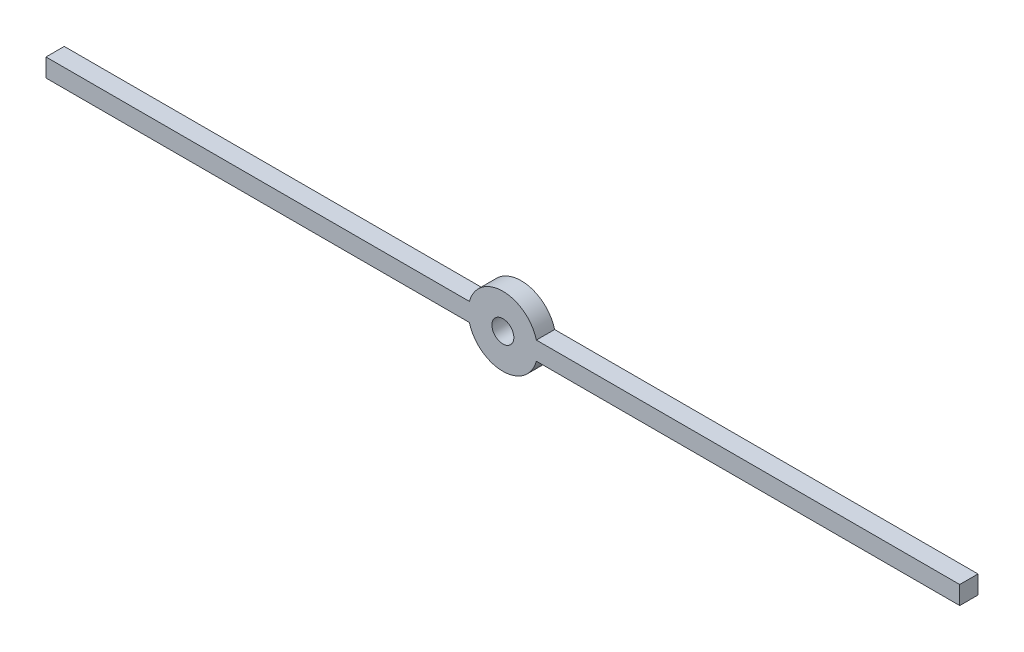
ISO-10303-21;
HEADER;
FILE_DESCRIPTION(('STEP AP214'),'2;1');
FILE_NAME('part.step','',(''),(''),'','','');
FILE_SCHEMA(('AUTOMOTIVE_DESIGN { 1 0 10303 214 1 1 1 1 }'));
ENDSEC;
DATA;
#1=APPLICATION_CONTEXT('core data for automotive mechanical design processes');
#2=APPLICATION_PROTOCOL_DEFINITION('international standard','automotive_design',2000,#1);
#3=PRODUCT_CONTEXT('',#1,'mechanical');
#4=PRODUCT('Part','Part','',(#3));
#5=PRODUCT_RELATED_PRODUCT_CATEGORY('part','',(#4));
#6=PRODUCT_DEFINITION_FORMATION('','',#4);
#7=PRODUCT_DEFINITION_CONTEXT('part definition',#1,'design');
#8=PRODUCT_DEFINITION('design','',#6,#7);
#9=PRODUCT_DEFINITION_SHAPE('','',#8);
#10=(LENGTH_UNIT() NAMED_UNIT(*) SI_UNIT(.MILLI.,.METRE.));
#11=(NAMED_UNIT(*) PLANE_ANGLE_UNIT() SI_UNIT($,.RADIAN.));
#12=(NAMED_UNIT(*) SI_UNIT($,.STERADIAN.) SOLID_ANGLE_UNIT());
#13=UNCERTAINTY_MEASURE_WITH_UNIT(LENGTH_MEASURE(1.E-05),#10,'distance_accuracy_value','');
#14=(GEOMETRIC_REPRESENTATION_CONTEXT(3) GLOBAL_UNCERTAINTY_ASSIGNED_CONTEXT((#13)) GLOBAL_UNIT_ASSIGNED_CONTEXT((#10,
#11,#12)) REPRESENTATION_CONTEXT('',''));
#15=CARTESIAN_POINT('',(0.,0.,0.));
#16=DIRECTION('',(0.,0.,1.));
#17=DIRECTION('',(1.,0.,0.));
#18=AXIS2_PLACEMENT_3D('',#15,#16,#17);
#19=CARTESIAN_POINT('',(-1.94289029309402E-13,0.,5.));
#20=DIRECTION('',(0.,0.,1.));
#21=DIRECTION('',(1.,0.,0.));
#22=AXIS2_PLACEMENT_3D('',#19,#20,#21);
#23=PLANE('',#22);
#24=DIRECTION('',(-1.,0.,0.));
#25=VECTOR('',#24,1.);
#26=CARTESIAN_POINT('',(9.16515138991148,2.5,5.));
#27=LINE('',#26,#25);
#28=CARTESIAN_POINT('',(125.,2.5,5.));
#29=VERTEX_POINT('',#28);
#30=CARTESIAN_POINT('',(9.16515138991149,2.5,5.));
#31=VERTEX_POINT('',#30);
#32=EDGE_CURVE('E164',#29,#31,#27,.T.);
#33=ORIENTED_EDGE('',*,*,#32,.T.);
#34=CARTESIAN_POINT('',(-1.94289029309402E-13,0.,5.));
#35=DIRECTION('',(0.,0.,1.));
#36=DIRECTION('',(1.,0.,0.));
#37=AXIS2_PLACEMENT_3D('',#34,#35,#36);
#38=CIRCLE('',#37,9.5);
#39=CARTESIAN_POINT('',(-9.16515138991188,2.5,5.));
#40=VERTEX_POINT('',#39);
#41=EDGE_CURVE('E100',#31,#40,#38,.T.);
#42=ORIENTED_EDGE('',*,*,#41,.T.);
#43=DIRECTION('',(-1.,0.,0.));
#44=VECTOR('',#43,1.);
#45=CARTESIAN_POINT('',(-125.,2.5,5.));
#46=LINE('',#45,#44);
#47=CARTESIAN_POINT('',(-125.,2.5,5.));
#48=VERTEX_POINT('',#47);
#49=EDGE_CURVE('E185',#40,#48,#46,.T.);
#50=ORIENTED_EDGE('',*,*,#49,.T.);
#51=DIRECTION('',(0.,-1.,0.));
#52=VECTOR('',#51,1.);
#53=CARTESIAN_POINT('',(-125.,-2.5,5.));
#54=LINE('',#53,#52);
#55=CARTESIAN_POINT('',(-125.,-2.5,5.));
#56=VERTEX_POINT('',#55);
#57=EDGE_CURVE('E199',#48,#56,#54,.T.);
#58=ORIENTED_EDGE('',*,*,#57,.T.);
#59=DIRECTION('',(1.,0.,0.));
#60=VECTOR('',#59,1.);
#61=CARTESIAN_POINT('',(-125.,-2.5,5.));
#62=LINE('',#61,#60);
#63=CARTESIAN_POINT('',(-9.16515138991188,-2.5,5.));
#64=VERTEX_POINT('',#63);
#65=EDGE_CURVE('E119',#56,#64,#62,.T.);
#66=ORIENTED_EDGE('',*,*,#65,.T.);
#67=CARTESIAN_POINT('',(-1.94289029309402E-13,0.,5.));
#68=DIRECTION('',(0.,0.,1.));
#69=DIRECTION('',(1.,0.,0.));
#70=AXIS2_PLACEMENT_3D('',#67,#68,#69);
#71=CIRCLE('',#70,9.5);
#72=CARTESIAN_POINT('',(9.16515138991149,-2.5,5.));
#73=VERTEX_POINT('',#72);
#74=EDGE_CURVE('E113',#64,#73,#71,.T.);
#75=ORIENTED_EDGE('',*,*,#74,.T.);
#76=DIRECTION('',(1.,0.,0.));
#77=VECTOR('',#76,1.);
#78=CARTESIAN_POINT('',(9.16515138991149,-2.5,5.));
#79=LINE('',#78,#77);
#80=CARTESIAN_POINT('',(125.,-2.5,5.));
#81=VERTEX_POINT('',#80);
#82=EDGE_CURVE('E117',#73,#81,#79,.T.);
#83=ORIENTED_EDGE('',*,*,#82,.T.);
#84=DIRECTION('',(0.,1.,0.));
#85=VECTOR('',#84,1.);
#86=CARTESIAN_POINT('',(125.,-2.5,5.));
#87=LINE('',#86,#85);
#88=EDGE_CURVE('E57',#81,#29,#87,.T.);
#89=ORIENTED_EDGE('',*,*,#88,.T.);
#90=EDGE_LOOP('',(#33,#42,#50,#58,#66,#75,#83,#89));
#91=FACE_BOUND('',#90,.T.);
#92=CARTESIAN_POINT('',(-1.94289029309402E-13,0.,5.));
#93=DIRECTION('',(0.,0.,1.));
#94=DIRECTION('',(1.,0.,0.));
#95=AXIS2_PLACEMENT_3D('',#92,#93,#94);
#96=CIRCLE('',#95,3.);
#97=CARTESIAN_POINT('',(2.99999999999981,0.,5.));
#98=VERTEX_POINT('',#97);
#99=EDGE_CURVE('E146',#98,#98,#96,.T.);
#100=ORIENTED_EDGE('',*,*,#99,.F.);
#101=EDGE_LOOP('',(#100));
#102=FACE_BOUND('',#101,.T.);
#103=ADVANCED_FACE('F39',(#91,#102),#23,.T.);
#104=CARTESIAN_POINT('',(-1.94289029309402E-13,0.,0.));
#105=DIRECTION('',(0.,0.,1.));
#106=DIRECTION('',(1.,0.,0.));
#107=AXIS2_PLACEMENT_3D('',#104,#105,#106);
#108=PLANE('',#107);
#109=DIRECTION('',(-1.,0.,0.));
#110=VECTOR('',#109,1.);
#111=CARTESIAN_POINT('',(9.16515138991148,2.5,0.));
#112=LINE('',#111,#110);
#113=CARTESIAN_POINT('',(125.,2.5,0.));
#114=VERTEX_POINT('',#113);
#115=CARTESIAN_POINT('',(9.16515138991149,2.5,0.));
#116=VERTEX_POINT('',#115);
#117=EDGE_CURVE('E141',#114,#116,#112,.T.);
#118=ORIENTED_EDGE('',*,*,#117,.F.);
#119=DIRECTION('',(0.,1.,0.));
#120=VECTOR('',#119,1.);
#121=CARTESIAN_POINT('',(125.,-2.5,0.));
#122=LINE('',#121,#120);
#123=CARTESIAN_POINT('',(125.,-2.5,0.));
#124=VERTEX_POINT('',#123);
#125=EDGE_CURVE('E92',#124,#114,#122,.T.);
#126=ORIENTED_EDGE('',*,*,#125,.F.);
#127=DIRECTION('',(1.,0.,0.));
#128=VECTOR('',#127,1.);
#129=CARTESIAN_POINT('',(9.16515138991149,-2.5,0.));
#130=LINE('',#129,#128);
#131=CARTESIAN_POINT('',(9.16515138991149,-2.5,0.));
#132=VERTEX_POINT('',#131);
#133=EDGE_CURVE('E86',#132,#124,#130,.T.);
#134=ORIENTED_EDGE('',*,*,#133,.F.);
#135=CARTESIAN_POINT('',(-1.94289029309402E-13,0.,0.));
#136=DIRECTION('',(0.,0.,1.));
#137=DIRECTION('',(1.,0.,0.));
#138=AXIS2_PLACEMENT_3D('',#135,#136,#137);
#139=CIRCLE('',#138,9.5);
#140=CARTESIAN_POINT('',(-9.16515138991188,-2.5,0.));
#141=VERTEX_POINT('',#140);
#142=EDGE_CURVE('E128',#141,#132,#139,.T.);
#143=ORIENTED_EDGE('',*,*,#142,.F.);
#144=DIRECTION('',(1.,0.,0.));
#145=VECTOR('',#144,1.);
#146=CARTESIAN_POINT('',(-125.,-2.5,0.));
#147=LINE('',#146,#145);
#148=CARTESIAN_POINT('',(-125.,-2.5,0.));
#149=VERTEX_POINT('',#148);
#150=EDGE_CURVE('E155',#149,#141,#147,.T.);
#151=ORIENTED_EDGE('',*,*,#150,.F.);
#152=DIRECTION('',(0.,-1.,0.));
#153=VECTOR('',#152,1.);
#154=CARTESIAN_POINT('',(-125.,-2.5,0.));
#155=LINE('',#154,#153);
#156=CARTESIAN_POINT('',(-125.,2.5,0.));
#157=VERTEX_POINT('',#156);
#158=EDGE_CURVE('E152',#157,#149,#155,.T.);
#159=ORIENTED_EDGE('',*,*,#158,.F.);
#160=DIRECTION('',(-1.,0.,0.));
#161=VECTOR('',#160,1.);
#162=CARTESIAN_POINT('',(-125.,2.5,0.));
#163=LINE('',#162,#161);
#164=CARTESIAN_POINT('',(-9.16515138991188,2.5,0.));
#165=VERTEX_POINT('',#164);
#166=EDGE_CURVE('E149',#165,#157,#163,.T.);
#167=ORIENTED_EDGE('',*,*,#166,.F.);
#168=CARTESIAN_POINT('',(-1.94289029309402E-13,0.,0.));
#169=DIRECTION('',(0.,0.,1.));
#170=DIRECTION('',(1.,0.,0.));
#171=AXIS2_PLACEMENT_3D('',#168,#169,#170);
#172=CIRCLE('',#171,9.5);
#173=EDGE_CURVE('E145',#116,#165,#172,.T.);
#174=ORIENTED_EDGE('',*,*,#173,.F.);
#175=EDGE_LOOP('',(#118,#126,#134,#143,#151,#159,#167,#174));
#176=FACE_BOUND('',#175,.T.);
#177=CARTESIAN_POINT('',(-1.94289029309402E-13,0.,0.));
#178=DIRECTION('',(0.,0.,1.));
#179=DIRECTION('',(1.,0.,0.));
#180=AXIS2_PLACEMENT_3D('',#177,#178,#179);
#181=CIRCLE('',#180,3.);
#182=CARTESIAN_POINT('',(2.99999999999981,0.,0.));
#183=VERTEX_POINT('',#182);
#184=EDGE_CURVE('E209',#183,#183,#181,.T.);
#185=ORIENTED_EDGE('',*,*,#184,.T.);
#186=EDGE_LOOP('',(#185));
#187=FACE_BOUND('',#186,.T.);
#188=ADVANCED_FACE('F189',(#176,#187),#108,.F.);
#189=CARTESIAN_POINT('',(9.16515138991148,2.5,5.));
#190=DIRECTION('',(0.,-1.,0.));
#191=DIRECTION('',(0.,0.,-1.));
#192=AXIS2_PLACEMENT_3D('',#189,#190,#191);
#193=PLANE('',#192);
#194=ORIENTED_EDGE('',*,*,#117,.T.);
#195=DIRECTION('',(0.,0.,-1.));
#196=VECTOR('',#195,1.);
#197=CARTESIAN_POINT('',(9.16515138991149,2.5,5.));
#198=LINE('',#197,#196);
#199=EDGE_CURVE('E11',#31,#116,#198,.T.);
#200=ORIENTED_EDGE('',*,*,#199,.F.);
#201=ORIENTED_EDGE('',*,*,#32,.F.);
#202=DIRECTION('',(0.,0.,-1.));
#203=VECTOR('',#202,1.);
#204=CARTESIAN_POINT('',(125.,2.5,5.));
#205=LINE('',#204,#203);
#206=EDGE_CURVE('E137',#29,#114,#205,.T.);
#207=ORIENTED_EDGE('',*,*,#206,.T.);
#208=EDGE_LOOP('',(#194,#200,#201,#207));
#209=FACE_BOUND('',#208,.T.);
#210=ADVANCED_FACE('F41',(#209),#193,.F.);
#211=CARTESIAN_POINT('',(-1.94289029309402E-13,0.,5.));
#212=DIRECTION('',(0.,0.,-1.));
#213=DIRECTION('',(-1.,0.,0.));
#214=AXIS2_PLACEMENT_3D('',#211,#212,#213);
#215=CYLINDRICAL_SURFACE('',#214,9.5);
#216=ORIENTED_EDGE('',*,*,#173,.T.);
#217=DIRECTION('',(0.,0.,-1.));
#218=VECTOR('',#217,1.);
#219=CARTESIAN_POINT('',(-9.16515138991188,2.5,5.));
#220=LINE('',#219,#218);
#221=EDGE_CURVE('E49',#40,#165,#220,.T.);
#222=ORIENTED_EDGE('',*,*,#221,.F.);
#223=ORIENTED_EDGE('',*,*,#41,.F.);
#224=ORIENTED_EDGE('',*,*,#199,.T.);
#225=EDGE_LOOP('',(#216,#222,#223,#224));
#226=FACE_BOUND('',#225,.T.);
#227=ADVANCED_FACE('F239',(#226),#215,.T.);
#228=CARTESIAN_POINT('',(-125.,2.5,5.));
#229=DIRECTION('',(0.,-1.,0.));
#230=DIRECTION('',(0.,0.,-1.));
#231=AXIS2_PLACEMENT_3D('',#228,#229,#230);
#232=PLANE('',#231);
#233=ORIENTED_EDGE('',*,*,#166,.T.);
#234=DIRECTION('',(0.,0.,-1.));
#235=VECTOR('',#234,1.);
#236=CARTESIAN_POINT('',(-125.,2.5,5.));
#237=LINE('',#236,#235);
#238=EDGE_CURVE('E175',#48,#157,#237,.T.);
#239=ORIENTED_EDGE('',*,*,#238,.F.);
#240=ORIENTED_EDGE('',*,*,#49,.F.);
#241=ORIENTED_EDGE('',*,*,#221,.T.);
#242=EDGE_LOOP('',(#233,#239,#240,#241));
#243=FACE_BOUND('',#242,.T.);
#244=ADVANCED_FACE('F183',(#243),#232,.F.);
#245=CARTESIAN_POINT('',(-125.,-2.5,5.));
#246=DIRECTION('',(1.,0.,0.));
#247=DIRECTION('',(0.,0.,-1.));
#248=AXIS2_PLACEMENT_3D('',#245,#246,#247);
#249=PLANE('',#248);
#250=ORIENTED_EDGE('',*,*,#158,.T.);
#251=DIRECTION('',(0.,0.,-1.));
#252=VECTOR('',#251,1.);
#253=CARTESIAN_POINT('',(-125.,-2.5,5.));
#254=LINE('',#253,#252);
#255=EDGE_CURVE('E171',#56,#149,#254,.T.);
#256=ORIENTED_EDGE('',*,*,#255,.F.);
#257=ORIENTED_EDGE('',*,*,#57,.F.);
#258=ORIENTED_EDGE('',*,*,#238,.T.);
#259=EDGE_LOOP('',(#250,#256,#257,#258));
#260=FACE_BOUND('',#259,.T.);
#261=ADVANCED_FACE('F194',(#260),#249,.F.);
#262=CARTESIAN_POINT('',(-125.,-2.5,5.));
#263=DIRECTION('',(0.,1.,0.));
#264=DIRECTION('',(0.,0.,1.));
#265=AXIS2_PLACEMENT_3D('',#262,#263,#264);
#266=PLANE('',#265);
#267=ORIENTED_EDGE('',*,*,#150,.T.);
#268=DIRECTION('',(0.,0.,-1.));
#269=VECTOR('',#268,1.);
#270=CARTESIAN_POINT('',(-9.16515138991188,-2.5,5.));
#271=LINE('',#270,#269);
#272=EDGE_CURVE('E130',#64,#141,#271,.T.);
#273=ORIENTED_EDGE('',*,*,#272,.F.);
#274=ORIENTED_EDGE('',*,*,#65,.F.);
#275=ORIENTED_EDGE('',*,*,#255,.T.);
#276=EDGE_LOOP('',(#267,#273,#274,#275));
#277=FACE_BOUND('',#276,.T.);
#278=ADVANCED_FACE('F197',(#277),#266,.F.);
#279=CARTESIAN_POINT('',(-1.94289029309402E-13,0.,5.));
#280=DIRECTION('',(0.,0.,-1.));
#281=DIRECTION('',(-1.,0.,0.));
#282=AXIS2_PLACEMENT_3D('',#279,#280,#281);
#283=CYLINDRICAL_SURFACE('',#282,9.5);
#284=ORIENTED_EDGE('',*,*,#142,.T.);
#285=DIRECTION('',(0.,0.,-1.));
#286=VECTOR('',#285,1.);
#287=CARTESIAN_POINT('',(9.16515138991149,-2.5,5.));
#288=LINE('',#287,#286);
#289=EDGE_CURVE('E125',#73,#132,#288,.T.);
#290=ORIENTED_EDGE('',*,*,#289,.F.);
#291=ORIENTED_EDGE('',*,*,#74,.F.);
#292=ORIENTED_EDGE('',*,*,#272,.T.);
#293=EDGE_LOOP('',(#284,#290,#291,#292));
#294=FACE_BOUND('',#293,.T.);
#295=ADVANCED_FACE('F126',(#294),#283,.T.);
#296=CARTESIAN_POINT('',(9.16515138991149,-2.5,5.));
#297=DIRECTION('',(0.,1.,0.));
#298=DIRECTION('',(0.,0.,1.));
#299=AXIS2_PLACEMENT_3D('',#296,#297,#298);
#300=PLANE('',#299);
#301=ORIENTED_EDGE('',*,*,#133,.T.);
#302=DIRECTION('',(0.,0.,-1.));
#303=VECTOR('',#302,1.);
#304=CARTESIAN_POINT('',(125.,-2.5,5.));
#305=LINE('',#304,#303);
#306=EDGE_CURVE('E131',#81,#124,#305,.T.);
#307=ORIENTED_EDGE('',*,*,#306,.F.);
#308=ORIENTED_EDGE('',*,*,#82,.F.);
#309=ORIENTED_EDGE('',*,*,#289,.T.);
#310=EDGE_LOOP('',(#301,#307,#308,#309));
#311=FACE_BOUND('',#310,.T.);
#312=ADVANCED_FACE('F133',(#311),#300,.F.);
#313=CARTESIAN_POINT('',(125.,-2.5,5.));
#314=DIRECTION('',(-1.,0.,0.));
#315=DIRECTION('',(0.,0.,1.));
#316=AXIS2_PLACEMENT_3D('',#313,#314,#315);
#317=PLANE('',#316);
#318=ORIENTED_EDGE('',*,*,#125,.T.);
#319=ORIENTED_EDGE('',*,*,#206,.F.);
#320=ORIENTED_EDGE('',*,*,#88,.F.);
#321=ORIENTED_EDGE('',*,*,#306,.T.);
#322=EDGE_LOOP('',(#318,#319,#320,#321));
#323=FACE_BOUND('',#322,.T.);
#324=ADVANCED_FACE('F227',(#323),#317,.F.);
#325=CARTESIAN_POINT('',(-1.94289029309402E-13,0.,5.));
#326=DIRECTION('',(0.,0.,-1.));
#327=DIRECTION('',(-1.,0.,0.));
#328=AXIS2_PLACEMENT_3D('',#325,#326,#327);
#329=CYLINDRICAL_SURFACE('',#328,3.);
#330=ORIENTED_EDGE('',*,*,#99,.T.);
#331=EDGE_LOOP('',(#330));
#332=FACE_BOUND('',#331,.T.);
#333=ORIENTED_EDGE('',*,*,#184,.F.);
#334=EDGE_LOOP('',(#333));
#335=FACE_BOUND('',#334,.T.);
#336=ADVANCED_FACE('F217',(#332,#335),#329,.F.);
#337=CLOSED_SHELL('',(#103,#188,#210,#227,#244,#261,#278,#295,#312,#324,#336));
#338=MANIFOLD_SOLID_BREP('B2',#337);
#339=ADVANCED_BREP_SHAPE_REPRESENTATION('',(#18,#338),#14);
#340=SHAPE_DEFINITION_REPRESENTATION(#9,#339);
ENDSEC;
END-ISO-10303-21;
